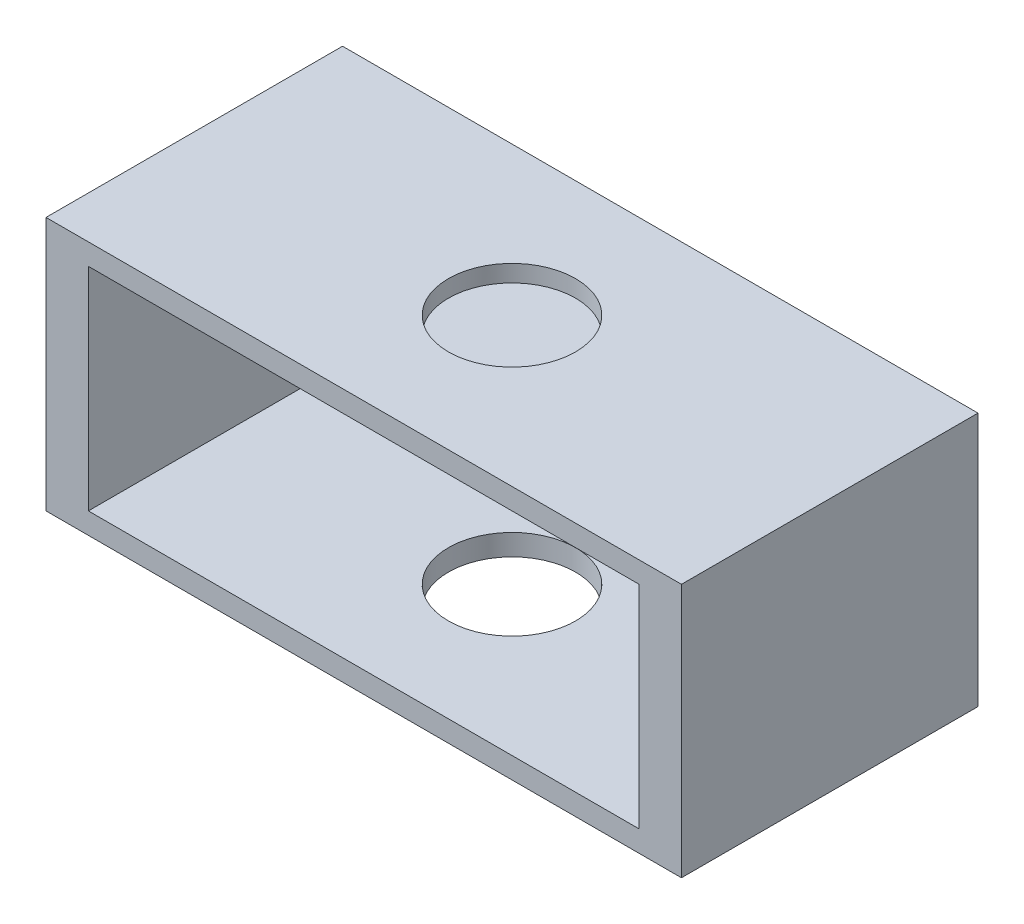
ISO-10303-21;
HEADER;
FILE_DESCRIPTION(('STEP AP214'),'2;1');
FILE_NAME('part.step','',(''),(''),'','','');
FILE_SCHEMA(('AUTOMOTIVE_DESIGN { 1 0 10303 214 1 1 1 1 }'));
ENDSEC;
DATA;
#1=APPLICATION_CONTEXT('core data for automotive mechanical design processes');
#2=APPLICATION_PROTOCOL_DEFINITION('international standard','automotive_design',2000,#1);
#3=PRODUCT_CONTEXT('',#1,'mechanical');
#4=PRODUCT('Part','Part','',(#3));
#5=PRODUCT_RELATED_PRODUCT_CATEGORY('part','',(#4));
#6=PRODUCT_DEFINITION_FORMATION('','',#4);
#7=PRODUCT_DEFINITION_CONTEXT('part definition',#1,'design');
#8=PRODUCT_DEFINITION('design','',#6,#7);
#9=PRODUCT_DEFINITION_SHAPE('','',#8);
#10=(LENGTH_UNIT() NAMED_UNIT(*) SI_UNIT(.MILLI.,.METRE.));
#11=(NAMED_UNIT(*) PLANE_ANGLE_UNIT() SI_UNIT($,.RADIAN.));
#12=(NAMED_UNIT(*) SI_UNIT($,.STERADIAN.) SOLID_ANGLE_UNIT());
#13=UNCERTAINTY_MEASURE_WITH_UNIT(LENGTH_MEASURE(1.E-05),#10,'distance_accuracy_value','');
#14=(GEOMETRIC_REPRESENTATION_CONTEXT(3) GLOBAL_UNCERTAINTY_ASSIGNED_CONTEXT((#13)) GLOBAL_UNIT_ASSIGNED_CONTEXT((#10,
#11,#12)) REPRESENTATION_CONTEXT('',''));
#15=CARTESIAN_POINT('',(0.,0.,0.));
#16=DIRECTION('',(0.,0.,1.));
#17=DIRECTION('',(1.,0.,0.));
#18=AXIS2_PLACEMENT_3D('',#15,#16,#17);
#19=CARTESIAN_POINT('',(0.,12.,0.));
#20=DIRECTION('',(0.,-1.,0.));
#21=DIRECTION('',(0.,0.,-1.));
#22=AXIS2_PLACEMENT_3D('',#19,#20,#21);
#23=CYLINDRICAL_SURFACE('',#22,3.);
#24=CARTESIAN_POINT('',(0.,12.,0.));
#25=DIRECTION('',(0.,1.,0.));
#26=DIRECTION('',(0.,0.,1.));
#27=AXIS2_PLACEMENT_3D('',#24,#25,#26);
#28=CIRCLE('',#27,3.);
#29=CARTESIAN_POINT('',(0.,12.,3.));
#30=VERTEX_POINT('',#29);
#31=EDGE_CURVE('E131',#30,#30,#28,.T.);
#32=ORIENTED_EDGE('',*,*,#31,.T.);
#33=EDGE_LOOP('',(#32));
#34=FACE_BOUND('',#33,.T.);
#35=CARTESIAN_POINT('',(0.,11.2,0.));
#36=DIRECTION('',(0.,-1.,0.));
#37=DIRECTION('',(0.,0.,-1.));
#38=AXIS2_PLACEMENT_3D('',#35,#36,#37);
#39=CIRCLE('',#38,3.);
#40=CARTESIAN_POINT('',(0.,11.2,-3.));
#41=VERTEX_POINT('',#40);
#42=EDGE_CURVE('E391',#41,#41,#39,.T.);
#43=ORIENTED_EDGE('',*,*,#42,.T.);
#44=EDGE_LOOP('',(#43));
#45=FACE_BOUND('',#44,.T.);
#46=ADVANCED_FACE('F39',(#34,#45),#23,.F.);
#47=CARTESIAN_POINT('',(0.,1.,0.));
#48=DIRECTION('',(0.,-1.,0.));
#49=DIRECTION('',(0.,0.,-1.));
#50=AXIS2_PLACEMENT_3D('',#47,#48,#49);
#51=PLANE('',#50);
#52=CARTESIAN_POINT('',(0.,1.,0.));
#53=DIRECTION('',(0.,1.,0.));
#54=DIRECTION('',(0.,0.,1.));
#55=AXIS2_PLACEMENT_3D('',#52,#53,#54);
#56=CIRCLE('',#55,3.);
#57=CARTESIAN_POINT('',(0.,1.,2.99999999999999));
#58=VERTEX_POINT('',#57);
#59=EDGE_CURVE('E160',#58,#58,#56,.T.);
#60=ORIENTED_EDGE('',*,*,#59,.F.);
#61=EDGE_LOOP('',(#60));
#62=FACE_BOUND('',#61,.T.);
#63=DIRECTION('',(1.,0.,0.));
#64=VECTOR('',#63,1.);
#65=CARTESIAN_POINT('',(-15.,1.,6.99999999999999));
#66=LINE('',#65,#64);
#67=CARTESIAN_POINT('',(-13.,1.,6.99999999999999));
#68=VERTEX_POINT('',#67);
#69=CARTESIAN_POINT('',(12.9999999999999,1.,6.99999999999999));
#70=VERTEX_POINT('',#69);
#71=EDGE_CURVE('E59',#68,#70,#66,.T.);
#72=ORIENTED_EDGE('',*,*,#71,.T.);
#73=DIRECTION('',(0.,0.,-1.));
#74=VECTOR('',#73,1.);
#75=CARTESIAN_POINT('',(13.,1.,0.));
#76=LINE('',#75,#74);
#77=CARTESIAN_POINT('',(12.9999999999999,1.,-7.00000000000001));
#78=VERTEX_POINT('',#77);
#79=EDGE_CURVE('E54',#70,#78,#76,.T.);
#80=ORIENTED_EDGE('',*,*,#79,.T.);
#81=DIRECTION('',(-1.,0.,0.));
#82=VECTOR('',#81,1.);
#83=CARTESIAN_POINT('',(-15.,1.,-7.00000000000001));
#84=LINE('',#83,#82);
#85=CARTESIAN_POINT('',(-13.,1.,-7.00000000000001));
#86=VERTEX_POINT('',#85);
#87=EDGE_CURVE('E165',#78,#86,#84,.T.);
#88=ORIENTED_EDGE('',*,*,#87,.T.);
#89=DIRECTION('',(0.,0.,-1.));
#90=VECTOR('',#89,1.);
#91=CARTESIAN_POINT('',(-13.,1.,0.));
#92=LINE('',#91,#90);
#93=EDGE_CURVE('E147',#68,#86,#92,.T.);
#94=ORIENTED_EDGE('',*,*,#93,.F.);
#95=EDGE_LOOP('',(#72,#80,#88,#94));
#96=FACE_BOUND('',#95,.T.);
#97=ADVANCED_FACE('F202',(#62,#96),#51,.F.);
#98=CARTESIAN_POINT('',(0.,0.,0.));
#99=DIRECTION('',(0.,-1.,0.));
#100=DIRECTION('',(0.,0.,-1.));
#101=AXIS2_PLACEMENT_3D('',#98,#99,#100);
#102=PLANE('',#101);
#103=DIRECTION('',(0.,0.,-1.));
#104=VECTOR('',#103,1.);
#105=CARTESIAN_POINT('',(15.,0.,6.99999999999999));
#106=LINE('',#105,#104);
#107=CARTESIAN_POINT('',(15.,0.,6.99999999999999));
#108=VERTEX_POINT('',#107);
#109=CARTESIAN_POINT('',(15.,0.,-7.00000000000001));
#110=VERTEX_POINT('',#109);
#111=EDGE_CURVE('E108',#108,#110,#106,.T.);
#112=ORIENTED_EDGE('',*,*,#111,.F.);
#113=DIRECTION('',(1.,0.,0.));
#114=VECTOR('',#113,1.);
#115=CARTESIAN_POINT('',(-15.,0.,6.99999999999999));
#116=LINE('',#115,#114);
#117=CARTESIAN_POINT('',(-15.,0.,6.99999999999999));
#118=VERTEX_POINT('',#117);
#119=EDGE_CURVE('E167',#118,#108,#116,.T.);
#120=ORIENTED_EDGE('',*,*,#119,.F.);
#121=DIRECTION('',(0.,0.,1.));
#122=VECTOR('',#121,1.);
#123=CARTESIAN_POINT('',(-15.,0.,6.99999999999999));
#124=LINE('',#123,#122);
#125=CARTESIAN_POINT('',(-15.,0.,-7.00000000000001));
#126=VERTEX_POINT('',#125);
#127=EDGE_CURVE('E173',#126,#118,#124,.T.);
#128=ORIENTED_EDGE('',*,*,#127,.F.);
#129=DIRECTION('',(-1.,0.,0.));
#130=VECTOR('',#129,1.);
#131=CARTESIAN_POINT('',(-15.,0.,-7.00000000000001));
#132=LINE('',#131,#130);
#133=EDGE_CURVE('E171',#110,#126,#132,.T.);
#134=ORIENTED_EDGE('',*,*,#133,.F.);
#135=EDGE_LOOP('',(#112,#120,#128,#134));
#136=FACE_BOUND('',#135,.T.);
#137=CARTESIAN_POINT('',(0.,0.,0.));
#138=DIRECTION('',(0.,1.,0.));
#139=DIRECTION('',(0.,0.,1.));
#140=AXIS2_PLACEMENT_3D('',#137,#138,#139);
#141=CIRCLE('',#140,3.);
#142=CARTESIAN_POINT('',(0.,0.,2.99999999999999));
#143=VERTEX_POINT('',#142);
#144=EDGE_CURVE('E159',#143,#143,#141,.T.);
#145=ORIENTED_EDGE('',*,*,#144,.T.);
#146=EDGE_LOOP('',(#145));
#147=FACE_BOUND('',#146,.T.);
#148=ADVANCED_FACE('F184',(#136,#147),#102,.T.);
#149=CARTESIAN_POINT('',(15.,1.,6.99999999999999));
#150=DIRECTION('',(-1.,0.,0.));
#151=DIRECTION('',(0.,0.,1.));
#152=AXIS2_PLACEMENT_3D('',#149,#150,#151);
#153=PLANE('',#152);
#154=ORIENTED_EDGE('',*,*,#111,.T.);
#155=DIRECTION('',(0.,-1.,0.));
#156=VECTOR('',#155,1.);
#157=CARTESIAN_POINT('',(15.,1.,-7.00000000000001));
#158=LINE('',#157,#156);
#159=CARTESIAN_POINT('',(15.,12.,-7.00000000000001));
#160=VERTEX_POINT('',#159);
#161=EDGE_CURVE('E11',#160,#110,#158,.T.);
#162=ORIENTED_EDGE('',*,*,#161,.F.);
#163=DIRECTION('',(0.,0.,-1.));
#164=VECTOR('',#163,1.);
#165=CARTESIAN_POINT('',(15.,12.,7.00000000000001));
#166=LINE('',#165,#164);
#167=CARTESIAN_POINT('',(15.,12.,7.00000000000001));
#168=VERTEX_POINT('',#167);
#169=EDGE_CURVE('E106',#168,#160,#166,.T.);
#170=ORIENTED_EDGE('',*,*,#169,.F.);
#171=DIRECTION('',(0.,-1.,0.));
#172=VECTOR('',#171,1.);
#173=CARTESIAN_POINT('',(15.,1.,6.99999999999999));
#174=LINE('',#173,#172);
#175=EDGE_CURVE('E169',#168,#108,#174,.T.);
#176=ORIENTED_EDGE('',*,*,#175,.T.);
#177=EDGE_LOOP('',(#154,#162,#170,#176));
#178=FACE_BOUND('',#177,.T.);
#179=ADVANCED_FACE('F41',(#178),#153,.F.);
#180=CARTESIAN_POINT('',(-15.,1.,-7.00000000000001));
#181=DIRECTION('',(0.,0.,1.));
#182=DIRECTION('',(1.,0.,0.));
#183=AXIS2_PLACEMENT_3D('',#180,#181,#182);
#184=PLANE('',#183);
#185=DIRECTION('',(0.,-1.,0.));
#186=VECTOR('',#185,1.);
#187=CARTESIAN_POINT('',(-15.,1.,-7.00000000000001));
#188=LINE('',#187,#186);
#189=CARTESIAN_POINT('',(-15.,12.,-7.00000000000001));
#190=VERTEX_POINT('',#189);
#191=EDGE_CURVE('E47',#190,#126,#188,.T.);
#192=ORIENTED_EDGE('',*,*,#191,.F.);
#193=DIRECTION('',(-1.,0.,0.));
#194=VECTOR('',#193,1.);
#195=CARTESIAN_POINT('',(-15.,12.,-7.00000000000001));
#196=LINE('',#195,#194);
#197=EDGE_CURVE('E111',#160,#190,#196,.T.);
#198=ORIENTED_EDGE('',*,*,#197,.F.);
#199=ORIENTED_EDGE('',*,*,#161,.T.);
#200=ORIENTED_EDGE('',*,*,#133,.T.);
#201=EDGE_LOOP('',(#192,#198,#199,#200));
#202=FACE_BOUND('',#201,.T.);
#203=DIRECTION('',(-1.,0.,0.));
#204=VECTOR('',#203,1.);
#205=CARTESIAN_POINT('',(-15.,11.,-7.00000000000001));
#206=LINE('',#205,#204);
#207=CARTESIAN_POINT('',(12.9999999999999,11.,-7.00000000000001));
#208=VERTEX_POINT('',#207);
#209=CARTESIAN_POINT('',(-13.,11.,-7.00000000000001));
#210=VERTEX_POINT('',#209);
#211=EDGE_CURVE('E128',#208,#210,#206,.T.);
#212=ORIENTED_EDGE('',*,*,#211,.T.);
#213=DIRECTION('',(0.,-1.,0.));
#214=VECTOR('',#213,1.);
#215=CARTESIAN_POINT('',(-13.,11.,-7.00000000000001));
#216=LINE('',#215,#214);
#217=EDGE_CURVE('E151',#210,#86,#216,.T.);
#218=ORIENTED_EDGE('',*,*,#217,.T.);
#219=ORIENTED_EDGE('',*,*,#87,.F.);
#220=DIRECTION('',(0.,-1.,0.));
#221=VECTOR('',#220,1.);
#222=CARTESIAN_POINT('',(12.9999999999999,11.,-7.00000000000001));
#223=LINE('',#222,#221);
#224=EDGE_CURVE('E141',#208,#78,#223,.T.);
#225=ORIENTED_EDGE('',*,*,#224,.F.);
#226=EDGE_LOOP('',(#212,#218,#219,#225));
#227=FACE_BOUND('',#226,.T.);
#228=ADVANCED_FACE('F112',(#202,#227),#184,.F.);
#229=CARTESIAN_POINT('',(-15.,1.,6.99999999999999));
#230=DIRECTION('',(1.,0.,0.));
#231=DIRECTION('',(0.,0.,-1.));
#232=AXIS2_PLACEMENT_3D('',#229,#230,#231);
#233=PLANE('',#232);
#234=ORIENTED_EDGE('',*,*,#127,.T.);
#235=DIRECTION('',(0.,-1.,0.));
#236=VECTOR('',#235,1.);
#237=CARTESIAN_POINT('',(-15.,1.,6.99999999999999));
#238=LINE('',#237,#236);
#239=CARTESIAN_POINT('',(-15.,12.,7.00000000000001));
#240=VERTEX_POINT('',#239);
#241=EDGE_CURVE('E177',#240,#118,#238,.T.);
#242=ORIENTED_EDGE('',*,*,#241,.F.);
#243=DIRECTION('',(0.,0.,1.));
#244=VECTOR('',#243,1.);
#245=CARTESIAN_POINT('',(-15.,12.,7.00000000000001));
#246=LINE('',#245,#244);
#247=EDGE_CURVE('E118',#190,#240,#246,.T.);
#248=ORIENTED_EDGE('',*,*,#247,.F.);
#249=ORIENTED_EDGE('',*,*,#191,.T.);
#250=EDGE_LOOP('',(#234,#242,#248,#249));
#251=FACE_BOUND('',#250,.T.);
#252=ADVANCED_FACE('F181',(#251),#233,.F.);
#253=CARTESIAN_POINT('',(-15.,1.,6.99999999999999));
#254=DIRECTION('',(0.,0.,-1.));
#255=DIRECTION('',(-1.,0.,0.));
#256=AXIS2_PLACEMENT_3D('',#253,#254,#255);
#257=PLANE('',#256);
#258=DIRECTION('',(0.,-1.,0.));
#259=VECTOR('',#258,1.);
#260=CARTESIAN_POINT('',(-13.,11.,6.99999999999999));
#261=LINE('',#260,#259);
#262=CARTESIAN_POINT('',(-13.,11.,7.00000000000001));
#263=VERTEX_POINT('',#262);
#264=EDGE_CURVE('E156',#263,#68,#261,.T.);
#265=ORIENTED_EDGE('',*,*,#264,.F.);
#266=DIRECTION('',(1.,0.,0.));
#267=VECTOR('',#266,1.);
#268=CARTESIAN_POINT('',(-15.,11.,7.00000000000001));
#269=LINE('',#268,#267);
#270=CARTESIAN_POINT('',(13.,11.,6.99999999999999));
#271=VERTEX_POINT('',#270);
#272=EDGE_CURVE('E125',#263,#271,#269,.T.);
#273=ORIENTED_EDGE('',*,*,#272,.T.);
#274=DIRECTION('',(0.,-1.,0.));
#275=VECTOR('',#274,1.);
#276=CARTESIAN_POINT('',(13.,11.,6.99999999999999));
#277=LINE('',#276,#275);
#278=EDGE_CURVE('E145',#271,#70,#277,.T.);
#279=ORIENTED_EDGE('',*,*,#278,.T.);
#280=ORIENTED_EDGE('',*,*,#71,.F.);
#281=EDGE_LOOP('',(#265,#273,#279,#280));
#282=FACE_BOUND('',#281,.T.);
#283=ORIENTED_EDGE('',*,*,#119,.T.);
#284=ORIENTED_EDGE('',*,*,#175,.F.);
#285=DIRECTION('',(1.,0.,0.));
#286=VECTOR('',#285,1.);
#287=CARTESIAN_POINT('',(-15.,12.,7.00000000000001));
#288=LINE('',#287,#286);
#289=EDGE_CURVE('E124',#240,#168,#288,.T.);
#290=ORIENTED_EDGE('',*,*,#289,.F.);
#291=ORIENTED_EDGE('',*,*,#241,.T.);
#292=EDGE_LOOP('',(#283,#284,#290,#291));
#293=FACE_BOUND('',#292,.T.);
#294=ADVANCED_FACE('F187',(#282,#293),#257,.F.);
#295=CARTESIAN_POINT('',(0.,1.,0.));
#296=DIRECTION('',(0.,-1.,0.));
#297=DIRECTION('',(0.,0.,-1.));
#298=AXIS2_PLACEMENT_3D('',#295,#296,#297);
#299=CYLINDRICAL_SURFACE('',#298,3.);
#300=ORIENTED_EDGE('',*,*,#59,.T.);
#301=EDGE_LOOP('',(#300));
#302=FACE_BOUND('',#301,.T.);
#303=ORIENTED_EDGE('',*,*,#144,.F.);
#304=EDGE_LOOP('',(#303));
#305=FACE_BOUND('',#304,.T.);
#306=ADVANCED_FACE('F189',(#302,#305),#299,.F.);
#307=CARTESIAN_POINT('',(-13.,11.,0.));
#308=DIRECTION('',(-1.,0.,0.));
#309=DIRECTION('',(0.,0.,1.));
#310=AXIS2_PLACEMENT_3D('',#307,#308,#309);
#311=PLANE('',#310);
#312=ORIENTED_EDGE('',*,*,#93,.T.);
#313=ORIENTED_EDGE('',*,*,#217,.F.);
#314=DIRECTION('',(0.,0.,-1.));
#315=VECTOR('',#314,1.);
#316=CARTESIAN_POINT('',(-13.,11.,0.));
#317=LINE('',#316,#315);
#318=EDGE_CURVE('E148',#263,#210,#317,.T.);
#319=ORIENTED_EDGE('',*,*,#318,.F.);
#320=ORIENTED_EDGE('',*,*,#264,.T.);
#321=EDGE_LOOP('',(#312,#313,#319,#320));
#322=FACE_BOUND('',#321,.T.);
#323=ADVANCED_FACE('F196',(#322),#311,.F.);
#324=CARTESIAN_POINT('',(13.,11.,0.));
#325=DIRECTION('',(-1.,0.,0.));
#326=DIRECTION('',(0.,0.,1.));
#327=AXIS2_PLACEMENT_3D('',#324,#325,#326);
#328=PLANE('',#327);
#329=ORIENTED_EDGE('',*,*,#79,.F.);
#330=ORIENTED_EDGE('',*,*,#278,.F.);
#331=DIRECTION('',(0.,0.,-1.));
#332=VECTOR('',#331,1.);
#333=CARTESIAN_POINT('',(13.,11.,0.));
#334=LINE('',#333,#332);
#335=EDGE_CURVE('E138',#271,#208,#334,.T.);
#336=ORIENTED_EDGE('',*,*,#335,.T.);
#337=ORIENTED_EDGE('',*,*,#224,.T.);
#338=EDGE_LOOP('',(#329,#330,#336,#337));
#339=FACE_BOUND('',#338,.T.);
#340=ADVANCED_FACE('F222',(#339),#328,.T.);
#341=CARTESIAN_POINT('',(0.,11.,0.));
#342=DIRECTION('',(0.,-1.,0.));
#343=DIRECTION('',(0.,0.,-1.));
#344=AXIS2_PLACEMENT_3D('',#341,#342,#343);
#345=PLANE('',#344);
#346=ORIENTED_EDGE('',*,*,#318,.T.);
#347=ORIENTED_EDGE('',*,*,#211,.F.);
#348=ORIENTED_EDGE('',*,*,#335,.F.);
#349=ORIENTED_EDGE('',*,*,#272,.F.);
#350=EDGE_LOOP('',(#346,#347,#348,#349));
#351=FACE_BOUND('',#350,.T.);
#352=ADVANCED_FACE('F219',(#351),#345,.T.);
#353=CARTESIAN_POINT('',(0.,12.,0.));
#354=DIRECTION('',(0.,-1.,0.));
#355=DIRECTION('',(0.,0.,-1.));
#356=AXIS2_PLACEMENT_3D('',#353,#354,#355);
#357=PLANE('',#356);
#358=ORIENTED_EDGE('',*,*,#169,.T.);
#359=ORIENTED_EDGE('',*,*,#197,.T.);
#360=ORIENTED_EDGE('',*,*,#247,.T.);
#361=ORIENTED_EDGE('',*,*,#289,.T.);
#362=EDGE_LOOP('',(#358,#359,#360,#361));
#363=FACE_BOUND('',#362,.T.);
#364=ORIENTED_EDGE('',*,*,#31,.F.);
#365=EDGE_LOOP('',(#364));
#366=FACE_BOUND('',#365,.T.);
#367=ADVANCED_FACE('F121',(#363,#366),#357,.F.);
#368=CARTESIAN_POINT('',(0.,11.2,0.));
#369=DIRECTION('',(0.,-1.,0.));
#370=DIRECTION('',(0.,0.,-1.));
#371=AXIS2_PLACEMENT_3D('',#368,#369,#370);
#372=PLANE('',#371);
#373=ORIENTED_EDGE('',*,*,#42,.F.);
#374=EDGE_LOOP('',(#373));
#375=FACE_BOUND('',#374,.T.);
#376=ADVANCED_FACE('F216',(#375),#372,.F.);
#377=CLOSED_SHELL('',(#46,#97,#148,#179,#228,#252,#294,#306,#323,#340,#352,#367,#376));
#378=MANIFOLD_SOLID_BREP('B2',#377);
#379=ADVANCED_BREP_SHAPE_REPRESENTATION('',(#18,#378),#14);
#380=SHAPE_DEFINITION_REPRESENTATION(#9,#379);
ENDSEC;
END-ISO-10303-21;
